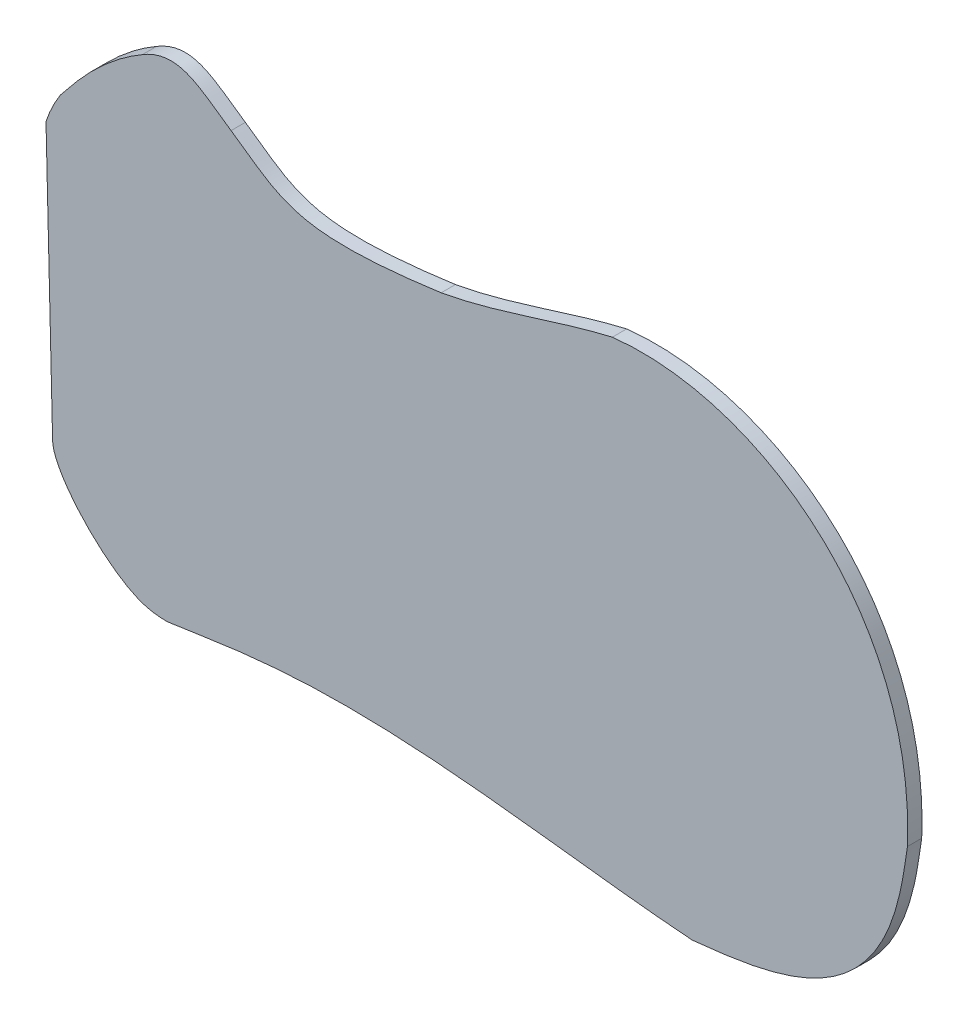
ISO-10303-21;
HEADER;
FILE_DESCRIPTION(('STEP AP214'),'2;1');
FILE_NAME('part.step','',(''),(''),'','','');
FILE_SCHEMA(('AUTOMOTIVE_DESIGN { 1 0 10303 214 1 1 1 1 }'));
ENDSEC;
DATA;
#1=APPLICATION_CONTEXT('core data for automotive mechanical design processes');
#2=APPLICATION_PROTOCOL_DEFINITION('international standard','automotive_design',2000,#1);
#3=PRODUCT_CONTEXT('',#1,'mechanical');
#4=PRODUCT('Part','Part','',(#3));
#5=PRODUCT_RELATED_PRODUCT_CATEGORY('part','',(#4));
#6=PRODUCT_DEFINITION_FORMATION('','',#4);
#7=PRODUCT_DEFINITION_CONTEXT('part definition',#1,'design');
#8=PRODUCT_DEFINITION('design','',#6,#7);
#9=PRODUCT_DEFINITION_SHAPE('','',#8);
#10=(LENGTH_UNIT() NAMED_UNIT(*) SI_UNIT(.MILLI.,.METRE.));
#11=(NAMED_UNIT(*) PLANE_ANGLE_UNIT() SI_UNIT($,.RADIAN.));
#12=(NAMED_UNIT(*) SI_UNIT($,.STERADIAN.) SOLID_ANGLE_UNIT());
#13=UNCERTAINTY_MEASURE_WITH_UNIT(LENGTH_MEASURE(1.E-05),#10,'distance_accuracy_value','');
#14=(GEOMETRIC_REPRESENTATION_CONTEXT(3) GLOBAL_UNCERTAINTY_ASSIGNED_CONTEXT((#13)) GLOBAL_UNIT_ASSIGNED_CONTEXT((#10,
#11,#12)) REPRESENTATION_CONTEXT('',''));
#15=CARTESIAN_POINT('',(0.,0.,0.));
#16=DIRECTION('',(0.,0.,1.));
#17=DIRECTION('',(1.,0.,0.));
#18=AXIS2_PLACEMENT_3D('',#15,#16,#17);
#19=CARTESIAN_POINT('',(124.596599464946,98.3672953037303,2.79000066176622));
#20=CARTESIAN_POINT('',(150.815811068151,101.351260217124,2.79000066176622));
#21=CARTESIAN_POINT('',(179.333586456396,81.748372940123,2.79000066176622));
#22=CARTESIAN_POINT('',(177.887396014204,45.3476449997819,2.79000066176622));
#23=B_SPLINE_CURVE_WITH_KNOTS('',3,(#19,#20,#21,#22),.UNSPECIFIED.,.F.,.F.,(4,4),(0.,1.),.UNSPECIFIED.);
#24=DIRECTION('',(0.,0.,-1.));
#25=VECTOR('',#24,1.);
#26=SURFACE_OF_LINEAR_EXTRUSION('',#23,#25);
#27=CARTESIAN_POINT('',(124.596599464946,98.3672953037303,0.210000661766221));
#28=CARTESIAN_POINT('',(150.815811068151,101.351260217124,0.210000661766221));
#29=CARTESIAN_POINT('',(179.333586456396,81.748372940123,0.210000661766221));
#30=CARTESIAN_POINT('',(177.887396014204,45.3476449997819,0.210000661766221));
#31=B_SPLINE_CURVE_WITH_KNOTS('',3,(#27,#28,#29,#30),.UNSPECIFIED.,.F.,.F.,(4,4),(0.,1.),.UNSPECIFIED.);
#32=CARTESIAN_POINT('',(124.596599464946,98.3672953037303,0.210000661766221));
#33=VERTEX_POINT('',#32);
#34=CARTESIAN_POINT('',(177.887396014204,45.3476449997819,0.210000661766221));
#35=VERTEX_POINT('',#34);
#36=EDGE_CURVE('E156',#33,#35,#31,.T.);
#37=ORIENTED_EDGE('',*,*,#36,.F.);
#38=DIRECTION('',(0.,0.,-1.));
#39=VECTOR('',#38,1.);
#40=CARTESIAN_POINT('',(124.596599464946,98.3672953037303,2.79000066176622));
#41=LINE('',#40,#39);
#42=CARTESIAN_POINT('',(124.596599464946,98.3672953037303,2.79000066176622));
#43=VERTEX_POINT('',#42);
#44=EDGE_CURVE('E11',#43,#33,#41,.T.);
#45=ORIENTED_EDGE('',*,*,#44,.F.);
#46=CARTESIAN_POINT('',(177.887396014204,45.3476449997819,2.79000066176622));
#47=VERTEX_POINT('',#46);
#48=EDGE_CURVE('E239',#43,#47,#23,.T.);
#49=ORIENTED_EDGE('',*,*,#48,.T.);
#50=DIRECTION('',(0.,0.,-1.));
#51=VECTOR('',#50,1.);
#52=CARTESIAN_POINT('',(177.887396014204,45.3476449997819,2.79000066176622));
#53=LINE('',#52,#51);
#54=EDGE_CURVE('E98',#47,#35,#53,.T.);
#55=ORIENTED_EDGE('',*,*,#54,.T.);
#56=EDGE_LOOP('',(#37,#45,#49,#55));
#57=FACE_BOUND('',#56,.T.);
#58=ADVANCED_FACE('F38',(#57),#26,.T.);
#59=CARTESIAN_POINT('',(93.6738604613284,89.8472221828837,2.79000066176622));
#60=CARTESIAN_POINT('',(104.232134236401,91.7707494408074,2.79000066176622));
#61=CARTESIAN_POINT('',(114.171262720889,95.9338130589506,2.79000066176622));
#62=CARTESIAN_POINT('',(124.596599464946,98.3672953037303,2.79000066176622));
#63=B_SPLINE_CURVE_WITH_KNOTS('',3,(#59,#60,#61,#62),.UNSPECIFIED.,.F.,.F.,(4,4),(0.,1.),.UNSPECIFIED.);
#64=DIRECTION('',(0.,0.,-1.));
#65=VECTOR('',#64,1.);
#66=SURFACE_OF_LINEAR_EXTRUSION('',#63,#65);
#67=CARTESIAN_POINT('',(93.6738604613284,89.8472221828837,0.210000661766221));
#68=CARTESIAN_POINT('',(104.232134236401,91.7707494408074,0.210000661766221));
#69=CARTESIAN_POINT('',(114.171262720889,95.9338130589506,0.210000661766221));
#70=CARTESIAN_POINT('',(124.596599464946,98.3672953037303,0.210000661766221));
#71=B_SPLINE_CURVE_WITH_KNOTS('',3,(#67,#68,#69,#70),.UNSPECIFIED.,.F.,.F.,(4,4),(0.,1.),.UNSPECIFIED.);
#72=CARTESIAN_POINT('',(93.6738604613284,89.8472221828837,0.210000661766221));
#73=VERTEX_POINT('',#72);
#74=EDGE_CURVE('E256',#73,#33,#71,.T.);
#75=ORIENTED_EDGE('',*,*,#74,.F.);
#76=DIRECTION('',(0.,0.,-1.));
#77=VECTOR('',#76,1.);
#78=CARTESIAN_POINT('',(93.6738604613284,89.8472221828837,2.79000066176622));
#79=LINE('',#78,#77);
#80=CARTESIAN_POINT('',(93.6738604613284,89.8472221828837,2.79000066176622));
#81=VERTEX_POINT('',#80);
#82=EDGE_CURVE('E47',#81,#73,#79,.T.);
#83=ORIENTED_EDGE('',*,*,#82,.F.);
#84=EDGE_CURVE('E231',#81,#43,#63,.T.);
#85=ORIENTED_EDGE('',*,*,#84,.T.);
#86=ORIENTED_EDGE('',*,*,#44,.T.);
#87=EDGE_LOOP('',(#75,#83,#85,#86));
#88=FACE_BOUND('',#87,.T.);
#89=ADVANCED_FACE('F246',(#88),#66,.T.);
#90=CARTESIAN_POINT('',(55.7316929714174,96.2428228005186,2.79000066176622));
#91=CARTESIAN_POINT('',(64.7786759830044,90.1448668115896,2.79000066176622));
#92=CARTESIAN_POINT('',(66.2941686613103,86.8191744233921,2.79000066176622));
#93=CARTESIAN_POINT('',(81.6363486812183,88.1745274070441,2.79000066176622));
#94=CARTESIAN_POINT('',(93.6738604613284,89.8472221828837,2.79000066176622));
#95=B_SPLINE_CURVE_WITH_KNOTS('',4,(#90,#91,#92,#93,#94),.UNSPECIFIED.,.F.,.F.,(5,5),(0.,1.),.UNSPECIFIED.);
#96=DIRECTION('',(0.,0.,-1.));
#97=VECTOR('',#96,1.);
#98=SURFACE_OF_LINEAR_EXTRUSION('',#95,#97);
#99=CARTESIAN_POINT('',(55.7316929714174,96.2428228005186,0.210000661766221));
#100=CARTESIAN_POINT('',(64.7786759830044,90.1448668115896,0.210000661766221));
#101=CARTESIAN_POINT('',(66.2941686613103,86.8191744233921,0.210000661766221));
#102=CARTESIAN_POINT('',(81.6363486812183,88.1745274070441,0.210000661766221));
#103=CARTESIAN_POINT('',(93.6738604613284,89.8472221828837,0.210000661766221));
#104=B_SPLINE_CURVE_WITH_KNOTS('',4,(#99,#100,#101,#102,#103),.UNSPECIFIED.,.F.,.F.,(5,5),(0.,
1.),.UNSPECIFIED.);
#105=CARTESIAN_POINT('',(55.7316929714174,96.2428228005186,0.210000661766221));
#106=VERTEX_POINT('',#105);
#107=EDGE_CURVE('E261',#106,#73,#104,.T.);
#108=ORIENTED_EDGE('',*,*,#107,.F.);
#109=DIRECTION('',(0.,0.,-1.));
#110=VECTOR('',#109,1.);
#111=CARTESIAN_POINT('',(55.7316929714174,96.2428228005186,2.79000066176622));
#112=LINE('',#111,#110);
#113=CARTESIAN_POINT('',(55.7316929714174,96.2428228005186,2.79000066176622));
#114=VERTEX_POINT('',#113);
#115=EDGE_CURVE('E333',#114,#106,#112,.T.);
#116=ORIENTED_EDGE('',*,*,#115,.F.);
#117=EDGE_CURVE('E222',#114,#81,#95,.T.);
#118=ORIENTED_EDGE('',*,*,#117,.T.);
#119=ORIENTED_EDGE('',*,*,#82,.T.);
#120=EDGE_LOOP('',(#108,#116,#118,#119));
#121=FACE_BOUND('',#120,.T.);
#122=ADVANCED_FACE('F214',(#121),#98,.T.);
#123=CARTESIAN_POINT('',(39.7018622347853,100.111738602764,2.79000066176622));
#124=CARTESIAN_POINT('',(41.7879913441369,101.397974996514,2.79000066176622));
#125=CARTESIAN_POINT('',(46.635299531051,103.674515387036,2.79000066176622));
#126=CARTESIAN_POINT('',(49.4109066582848,100.503234995782,2.79000066176622));
#127=CARTESIAN_POINT('',(55.7316929714174,96.2428228005186,2.79000066176622));
#128=B_SPLINE_CURVE_WITH_KNOTS('',4,(#123,#124,#125,#126,#127),.UNSPECIFIED.,.F.,.F.,(5,5),(0.,
1.),.UNSPECIFIED.);
#129=DIRECTION('',(0.,0.,-1.));
#130=VECTOR('',#129,1.);
#131=SURFACE_OF_LINEAR_EXTRUSION('',#128,#130);
#132=CARTESIAN_POINT('',(39.7018622347853,100.111738602764,0.210000661766221));
#133=CARTESIAN_POINT('',(41.7879913441369,101.397974996514,0.210000661766221));
#134=CARTESIAN_POINT('',(46.635299531051,103.674515387036,0.210000661766221));
#135=CARTESIAN_POINT('',(49.4109066582848,100.503234995782,0.210000661766221));
#136=CARTESIAN_POINT('',(55.7316929714174,96.2428228005186,0.210000661766221));
#137=B_SPLINE_CURVE_WITH_KNOTS('',4,(#132,#133,#134,#135,#136),.UNSPECIFIED.,.F.,.F.,(5,5),(0.,
1.),.UNSPECIFIED.);
#138=CARTESIAN_POINT('',(39.7018622347853,100.111738602764,0.210000661766221));
#139=VERTEX_POINT('',#138);
#140=EDGE_CURVE('E266',#139,#106,#137,.T.);
#141=ORIENTED_EDGE('',*,*,#140,.F.);
#142=DIRECTION('',(0.,0.,-1.));
#143=VECTOR('',#142,1.);
#144=CARTESIAN_POINT('',(39.7018622347853,100.111738602764,2.79000066176622));
#145=LINE('',#144,#143);
#146=CARTESIAN_POINT('',(39.7018622347853,100.111738602764,2.79000066176622));
#147=VERTEX_POINT('',#146);
#148=EDGE_CURVE('E331',#147,#139,#145,.T.);
#149=ORIENTED_EDGE('',*,*,#148,.F.);
#150=EDGE_CURVE('E217',#147,#114,#128,.T.);
#151=ORIENTED_EDGE('',*,*,#150,.T.);
#152=ORIENTED_EDGE('',*,*,#115,.T.);
#153=EDGE_LOOP('',(#141,#149,#151,#152));
#154=FACE_BOUND('',#153,.T.);
#155=ADVANCED_FACE('F210',(#154),#131,.T.);
#156=CARTESIAN_POINT('',(24.9109549420892,86.4033966597113,2.79000066176622));
#157=CARTESIAN_POINT('',(28.3810929794856,90.8111828776497,2.79000066176622));
#158=CARTESIAN_POINT('',(32.8222637913716,96.0853018164924,2.79000066176622));
#159=CARTESIAN_POINT('',(39.7018622347853,100.111738602764,2.79000066176622));
#160=B_SPLINE_CURVE_WITH_KNOTS('',3,(#156,#157,#158,#159),.UNSPECIFIED.,.F.,.F.,(4,4),(0.,1.),.UNSPECIFIED.);
#161=DIRECTION('',(0.,0.,-1.));
#162=VECTOR('',#161,1.);
#163=SURFACE_OF_LINEAR_EXTRUSION('',#160,#162);
#164=CARTESIAN_POINT('',(24.9109549420892,86.4033966597113,0.210000661766221));
#165=CARTESIAN_POINT('',(28.3810929794856,90.8111828776497,0.210000661766221));
#166=CARTESIAN_POINT('',(32.8222637913716,96.0853018164924,0.210000661766221));
#167=CARTESIAN_POINT('',(39.7018622347853,100.111738602764,0.210000661766221));
#168=B_SPLINE_CURVE_WITH_KNOTS('',3,(#164,#165,#166,#167),.UNSPECIFIED.,.F.,.F.,(4,4),(0.,1.),.UNSPECIFIED.);
#169=CARTESIAN_POINT('',(24.9109549420892,86.4033966597113,0.210000661766221));
#170=VERTEX_POINT('',#169);
#171=EDGE_CURVE('E268',#170,#139,#168,.T.);
#172=ORIENTED_EDGE('',*,*,#171,.F.);
#173=DIRECTION('',(0.,0.,-1.));
#174=VECTOR('',#173,1.);
#175=CARTESIAN_POINT('',(24.9109549420892,86.4033966597113,2.79000066176622));
#176=LINE('',#175,#174);
#177=CARTESIAN_POINT('',(24.9109549420892,86.4033966597113,2.79000066176622));
#178=VERTEX_POINT('',#177);
#179=EDGE_CURVE('E329',#178,#170,#176,.T.);
#180=ORIENTED_EDGE('',*,*,#179,.F.);
#181=EDGE_CURVE('E195',#178,#147,#160,.T.);
#182=ORIENTED_EDGE('',*,*,#181,.T.);
#183=ORIENTED_EDGE('',*,*,#148,.T.);
#184=EDGE_LOOP('',(#172,#180,#182,#183));
#185=FACE_BOUND('',#184,.T.);
#186=ADVANCED_FACE('F206',(#185),#163,.T.);
#187=CARTESIAN_POINT('',(22.3069260856761,80.9579464004333,2.79000066176622));
#188=CARTESIAN_POINT('',(23.244806441841,83.7976328036784,2.79000066176622));
#189=CARTESIAN_POINT('',(24.9109549420892,86.4033966597113,2.79000066176622));
#190=B_SPLINE_CURVE_WITH_KNOTS('',2,(#187,#188,#189),.UNSPECIFIED.,.F.,.F.,(3,3),(0.,1.),.UNSPECIFIED.);
#191=DIRECTION('',(0.,0.,-1.));
#192=VECTOR('',#191,1.);
#193=SURFACE_OF_LINEAR_EXTRUSION('',#190,#192);
#194=CARTESIAN_POINT('',(22.3069260856761,80.9579464004333,0.210000661766221));
#195=CARTESIAN_POINT('',(23.244806441841,83.7976328036784,0.210000661766221));
#196=CARTESIAN_POINT('',(24.9109549420892,86.4033966597113,0.210000661766221));
#197=B_SPLINE_CURVE_WITH_KNOTS('',2,(#194,#195,#196),.UNSPECIFIED.,.F.,.F.,(3,3),(0.,1.),.UNSPECIFIED.);
#198=CARTESIAN_POINT('',(22.3069260856761,80.9579464004333,0.210000661766221));
#199=VERTEX_POINT('',#198);
#200=EDGE_CURVE('E286',#199,#170,#197,.T.);
#201=ORIENTED_EDGE('',*,*,#200,.F.);
#202=DIRECTION('',(0.,0.,-1.));
#203=VECTOR('',#202,1.);
#204=CARTESIAN_POINT('',(22.3069260856761,80.9579464004333,2.79000066176622));
#205=LINE('',#204,#203);
#206=CARTESIAN_POINT('',(22.3069260856761,80.9579464004333,2.79000066176622));
#207=VERTEX_POINT('',#206);
#208=EDGE_CURVE('E327',#207,#199,#205,.T.);
#209=ORIENTED_EDGE('',*,*,#208,.F.);
#210=EDGE_CURVE('E189',#207,#178,#190,.T.);
#211=ORIENTED_EDGE('',*,*,#210,.T.);
#212=ORIENTED_EDGE('',*,*,#179,.T.);
#213=EDGE_LOOP('',(#201,#209,#211,#212));
#214=FACE_BOUND('',#213,.T.);
#215=ADVANCED_FACE('F203',(#214),#193,.T.);
#216=CARTESIAN_POINT('',(24.076368133515,7.85443184781372,2.79000066176622));
#217=DIRECTION('',(0.999707197081741,0.0241975226617918,0.));
#218=DIRECTION('',(-0.0241975226617918,0.999707197081742,0.));
#219=AXIS2_PLACEMENT_3D('',#216,#217,#218);
#220=PLANE('',#219);
#221=DIRECTION('',(0.0241975226617918,-0.999707197081742,0.));
#222=VECTOR('',#221,1.);
#223=CARTESIAN_POINT('',(24.076368133515,7.85443184781372,0.210000661766221));
#224=LINE('',#223,#222);
#225=CARTESIAN_POINT('',(23.4976984870914,31.7618466004786,0.210000661766221));
#226=VERTEX_POINT('',#225);
#227=EDGE_CURVE('E294',#199,#226,#224,.T.);
#228=ORIENTED_EDGE('',*,*,#227,.T.);
#229=DIRECTION('',(0.,0.,-1.));
#230=VECTOR('',#229,1.);
#231=CARTESIAN_POINT('',(23.4976984870914,31.7618466004786,2.79000066176622));
#232=LINE('',#231,#230);
#233=CARTESIAN_POINT('',(23.4976984870914,31.7618466004786,2.79000066176622));
#234=VERTEX_POINT('',#233);
#235=EDGE_CURVE('E324',#234,#226,#232,.T.);
#236=ORIENTED_EDGE('',*,*,#235,.F.);
#237=DIRECTION('',(0.0241975226617918,-0.999707197081742,0.));
#238=VECTOR('',#237,1.);
#239=CARTESIAN_POINT('',(24.076368133515,7.85443184781372,2.79000066176622));
#240=LINE('',#239,#238);
#241=EDGE_CURVE('E184',#207,#234,#240,.T.);
#242=ORIENTED_EDGE('',*,*,#241,.F.);
#243=ORIENTED_EDGE('',*,*,#208,.T.);
#244=EDGE_LOOP('',(#228,#236,#242,#243));
#245=FACE_BOUND('',#244,.T.);
#246=ADVANCED_FACE('F177',(#245),#220,.F.);
#247=CARTESIAN_POINT('',(23.4976984870914,31.7618466004786,2.79000066176622));
#248=CARTESIAN_POINT('',(23.4976984870914,25.5072002981915,2.79000066176622));
#249=CARTESIAN_POINT('',(36.7546866585817,13.1602713820546,2.79000066176622));
#250=CARTESIAN_POINT('',(40.2190051683397,13.8941844995759,2.79000066176622));
#251=CARTESIAN_POINT('',(44.1330705115969,13.6547900077421,2.79000066176622));
#252=B_SPLINE_CURVE_WITH_KNOTS('',4,(#247,#248,#249,#250,#251),.UNSPECIFIED.,.F.,.F.,(5,5),(0.,
1.),.UNSPECIFIED.);
#253=DIRECTION('',(0.,0.,-1.));
#254=VECTOR('',#253,1.);
#255=SURFACE_OF_LINEAR_EXTRUSION('',#252,#254);
#256=CARTESIAN_POINT('',(23.4976984870914,31.7618466004786,0.210000661766221));
#257=CARTESIAN_POINT('',(23.4976984870914,25.5072002981915,0.210000661766221));
#258=CARTESIAN_POINT('',(36.7546866585817,13.1602713820546,0.210000661766221));
#259=CARTESIAN_POINT('',(40.2190051683397,13.8941844995759,0.210000661766221));
#260=CARTESIAN_POINT('',(44.1330705115969,13.6547900077421,0.210000661766221));
#261=B_SPLINE_CURVE_WITH_KNOTS('',4,(#256,#257,#258,#259,#260),.UNSPECIFIED.,.F.,.F.,(5,5),(0.,
1.),.UNSPECIFIED.);
#262=CARTESIAN_POINT('',(44.1330705115969,13.6547900077421,0.210000661766221));
#263=VERTEX_POINT('',#262);
#264=EDGE_CURVE('E299',#226,#263,#261,.T.);
#265=ORIENTED_EDGE('',*,*,#264,.T.);
#266=DIRECTION('',(0.,0.,-1.));
#267=VECTOR('',#266,1.);
#268=CARTESIAN_POINT('',(44.1330705115969,13.6547900077421,2.79000066176622));
#269=LINE('',#268,#267);
#270=CARTESIAN_POINT('',(44.1330705115969,13.6547900077421,2.79000066176622));
#271=VERTEX_POINT('',#270);
#272=EDGE_CURVE('E143',#271,#263,#269,.T.);
#273=ORIENTED_EDGE('',*,*,#272,.F.);
#274=EDGE_CURVE('E130',#234,#271,#252,.T.);
#275=ORIENTED_EDGE('',*,*,#274,.F.);
#276=ORIENTED_EDGE('',*,*,#235,.T.);
#277=EDGE_LOOP('',(#265,#273,#275,#276));
#278=FACE_BOUND('',#277,.T.);
#279=ADVANCED_FACE('F174',(#278),#255,.F.);
#280=CARTESIAN_POINT('',(44.1330705115969,13.6547900077421,2.79000066176622));
#281=CARTESIAN_POINT('',(55.566789979744,15.0295347847206,2.79000066176622));
#282=CARTESIAN_POINT('',(78.3912945637245,21.0103790831186,2.79000066176622));
#283=CARTESIAN_POINT('',(107.728507275184,13.5856972460976,2.79000066176622));
#284=CARTESIAN_POINT('',(138.968962326014,11.2756475912792,2.79000066176622));
#285=B_SPLINE_CURVE_WITH_KNOTS('',4,(#280,#281,#282,#283,#284),.UNSPECIFIED.,.F.,.F.,(5,5),(0.,
1.),.UNSPECIFIED.);
#286=DIRECTION('',(0.,0.,-1.));
#287=VECTOR('',#286,1.);
#288=SURFACE_OF_LINEAR_EXTRUSION('',#285,#287);
#289=CARTESIAN_POINT('',(44.1330705115969,13.6547900077421,0.210000661766221));
#290=CARTESIAN_POINT('',(55.566789979744,15.0295347847206,0.210000661766221));
#291=CARTESIAN_POINT('',(78.3912945637245,21.0103790831186,0.210000661766221));
#292=CARTESIAN_POINT('',(107.728507275184,13.5856972460976,0.210000661766221));
#293=CARTESIAN_POINT('',(138.968962326014,11.2756475912792,0.210000661766221));
#294=B_SPLINE_CURVE_WITH_KNOTS('',4,(#289,#290,#291,#292,#293),.UNSPECIFIED.,.F.,.F.,(5,5),(0.,
1.),.UNSPECIFIED.);
#295=CARTESIAN_POINT('',(138.968962326014,11.2756475912792,0.210000661766221));
#296=VERTEX_POINT('',#295);
#297=EDGE_CURVE('E139',#263,#296,#294,.T.);
#298=ORIENTED_EDGE('',*,*,#297,.T.);
#299=DIRECTION('',(0.,0.,-1.));
#300=VECTOR('',#299,1.);
#301=CARTESIAN_POINT('',(138.968962326014,11.2756475912792,2.79000066176622));
#302=LINE('',#301,#300);
#303=CARTESIAN_POINT('',(138.968962326014,11.2756475912792,2.79000066176622));
#304=VERTEX_POINT('',#303);
#305=EDGE_CURVE('E136',#304,#296,#302,.T.);
#306=ORIENTED_EDGE('',*,*,#305,.F.);
#307=EDGE_CURVE('E124',#271,#304,#285,.T.);
#308=ORIENTED_EDGE('',*,*,#307,.F.);
#309=ORIENTED_EDGE('',*,*,#272,.T.);
#310=EDGE_LOOP('',(#298,#306,#308,#309));
#311=FACE_BOUND('',#310,.T.);
#312=ADVANCED_FACE('F137',(#311),#288,.F.);
#313=CARTESIAN_POINT('',(139.02603928865,12.0475402135631,2.79000066176622));
#314=DIRECTION('',(0.,0.,-1.));
#315=DIRECTION('',(-1.,0.,0.));
#316=AXIS2_PLACEMENT_3D('',#313,#314,#315);
#317=CYLINDRICAL_SURFACE('',#316,0.774000000000001);
#318=CARTESIAN_POINT('',(139.02603928865,12.0475402135631,0.210000661766221));
#319=DIRECTION('',(0.,0.,1.));
#320=DIRECTION('',(1.,0.,0.));
#321=AXIS2_PLACEMENT_3D('',#318,#319,#320);
#322=CIRCLE('',#321,0.774000000000001);
#323=CARTESIAN_POINT('',(139.10574463064,11.2776551192417,0.210000661766221));
#324=VERTEX_POINT('',#323);
#325=EDGE_CURVE('E309',#324,#296,#322,.F.);
#326=ORIENTED_EDGE('',*,*,#325,.F.);
#327=DIRECTION('',(0.,0.,-1.));
#328=VECTOR('',#327,1.);
#329=CARTESIAN_POINT('',(139.10574463064,11.2776551192417,2.79000066176622));
#330=LINE('',#329,#328);
#331=CARTESIAN_POINT('',(139.10574463064,11.2776551192417,2.79000066176622));
#332=VERTEX_POINT('',#331);
#333=EDGE_CURVE('E91',#332,#324,#330,.T.);
#334=ORIENTED_EDGE('',*,*,#333,.F.);
#335=CARTESIAN_POINT('',(139.02603928865,12.0475402135631,2.79000066176622));
#336=DIRECTION('',(0.,0.,1.));
#337=DIRECTION('',(1.,0.,0.));
#338=AXIS2_PLACEMENT_3D('',#335,#336,#337);
#339=CIRCLE('',#338,0.774000000000001);
#340=EDGE_CURVE('E128',#332,#304,#339,.F.);
#341=ORIENTED_EDGE('',*,*,#340,.T.);
#342=ORIENTED_EDGE('',*,*,#305,.T.);
#343=EDGE_LOOP('',(#326,#334,#341,#342));
#344=FACE_BOUND('',#343,.T.);
#345=ADVANCED_FACE('F145',(#344),#317,.T.);
#346=CARTESIAN_POINT('',(139.10574463064,11.2776551192417,2.79000066176622));
#347=CARTESIAN_POINT('',(157.325861364284,13.1639634086991,2.79000066176622));
#348=CARTESIAN_POINT('',(175.409680559452,15.9078530301022,2.79000066176622));
#349=CARTESIAN_POINT('',(176.603867070873,37.7288022771331,2.79000066176622));
#350=CARTESIAN_POINT('',(177.887396014204,45.3476449997819,2.79000066176622));
#351=B_SPLINE_CURVE_WITH_KNOTS('',4,(#346,#347,#348,#349,#350),.UNSPECIFIED.,.F.,.F.,(5,5),(0.,
1.),.UNSPECIFIED.);
#352=DIRECTION('',(0.,0.,-1.));
#353=VECTOR('',#352,1.);
#354=SURFACE_OF_LINEAR_EXTRUSION('',#351,#353);
#355=CARTESIAN_POINT('',(139.10574463064,11.2776551192417,0.210000661766221));
#356=CARTESIAN_POINT('',(157.325861364284,13.1639634086991,0.210000661766221));
#357=CARTESIAN_POINT('',(175.409680559452,15.9078530301022,0.210000661766221));
#358=CARTESIAN_POINT('',(176.603867070873,37.7288022771331,0.210000661766221));
#359=CARTESIAN_POINT('',(177.887396014204,45.3476449997819,0.210000661766221));
#360=B_SPLINE_CURVE_WITH_KNOTS('',4,(#355,#356,#357,#358,#359),.UNSPECIFIED.,.F.,.F.,(5,5),(0.,
1.),.UNSPECIFIED.);
#361=EDGE_CURVE('E314',#324,#35,#360,.T.);
#362=ORIENTED_EDGE('',*,*,#361,.T.);
#363=ORIENTED_EDGE('',*,*,#54,.F.);
#364=EDGE_CURVE('E55',#332,#47,#351,.T.);
#365=ORIENTED_EDGE('',*,*,#364,.F.);
#366=ORIENTED_EDGE('',*,*,#333,.T.);
#367=EDGE_LOOP('',(#362,#363,#365,#366));
#368=FACE_BOUND('',#367,.T.);
#369=ADVANCED_FACE('F164',(#368),#354,.F.);
#370=CARTESIAN_POINT('',(13.8042330075885,7.60579882484442,2.79000066176622));
#371=DIRECTION('',(0.,0.,1.));
#372=DIRECTION('',(1.,0.,0.));
#373=AXIS2_PLACEMENT_3D('',#370,#371,#372);
#374=PLANE('',#373);
#375=ORIENTED_EDGE('',*,*,#48,.F.);
#376=ORIENTED_EDGE('',*,*,#84,.F.);
#377=ORIENTED_EDGE('',*,*,#117,.F.);
#378=ORIENTED_EDGE('',*,*,#150,.F.);
#379=ORIENTED_EDGE('',*,*,#181,.F.);
#380=ORIENTED_EDGE('',*,*,#210,.F.);
#381=ORIENTED_EDGE('',*,*,#241,.T.);
#382=ORIENTED_EDGE('',*,*,#274,.T.);
#383=ORIENTED_EDGE('',*,*,#307,.T.);
#384=ORIENTED_EDGE('',*,*,#340,.F.);
#385=ORIENTED_EDGE('',*,*,#364,.T.);
#386=EDGE_LOOP('',(#375,#376,#377,#378,#379,#380,#381,#382,#383,#384,#385));
#387=FACE_BOUND('',#386,.T.);
#388=ADVANCED_FACE('F126',(#387),#374,.T.);
#389=CARTESIAN_POINT('',(13.8042330075885,7.60579882484442,0.210000661766221));
#390=DIRECTION('',(0.,0.,1.));
#391=DIRECTION('',(1.,0.,0.));
#392=AXIS2_PLACEMENT_3D('',#389,#390,#391);
#393=PLANE('',#392);
#394=ORIENTED_EDGE('',*,*,#36,.T.);
#395=ORIENTED_EDGE('',*,*,#361,.F.);
#396=ORIENTED_EDGE('',*,*,#325,.T.);
#397=ORIENTED_EDGE('',*,*,#297,.F.);
#398=ORIENTED_EDGE('',*,*,#264,.F.);
#399=ORIENTED_EDGE('',*,*,#227,.F.);
#400=ORIENTED_EDGE('',*,*,#200,.T.);
#401=ORIENTED_EDGE('',*,*,#171,.T.);
#402=ORIENTED_EDGE('',*,*,#140,.T.);
#403=ORIENTED_EDGE('',*,*,#107,.T.);
#404=ORIENTED_EDGE('',*,*,#74,.T.);
#405=EDGE_LOOP('',(#394,#395,#396,#397,#398,#399,#400,#401,#402,#403,#404));
#406=FACE_BOUND('',#405,.T.);
#407=ADVANCED_FACE('F168',(#406),#393,.F.);
#408=CLOSED_SHELL('',(#58,#89,#122,#155,#186,#215,#246,#279,#312,#345,#369,#388,#407));
#409=MANIFOLD_SOLID_BREP('B2',#408);
#410=ADVANCED_BREP_SHAPE_REPRESENTATION('',(#18,#409),#14);
#411=SHAPE_DEFINITION_REPRESENTATION(#9,#410);
ENDSEC;
END-ISO-10303-21;
